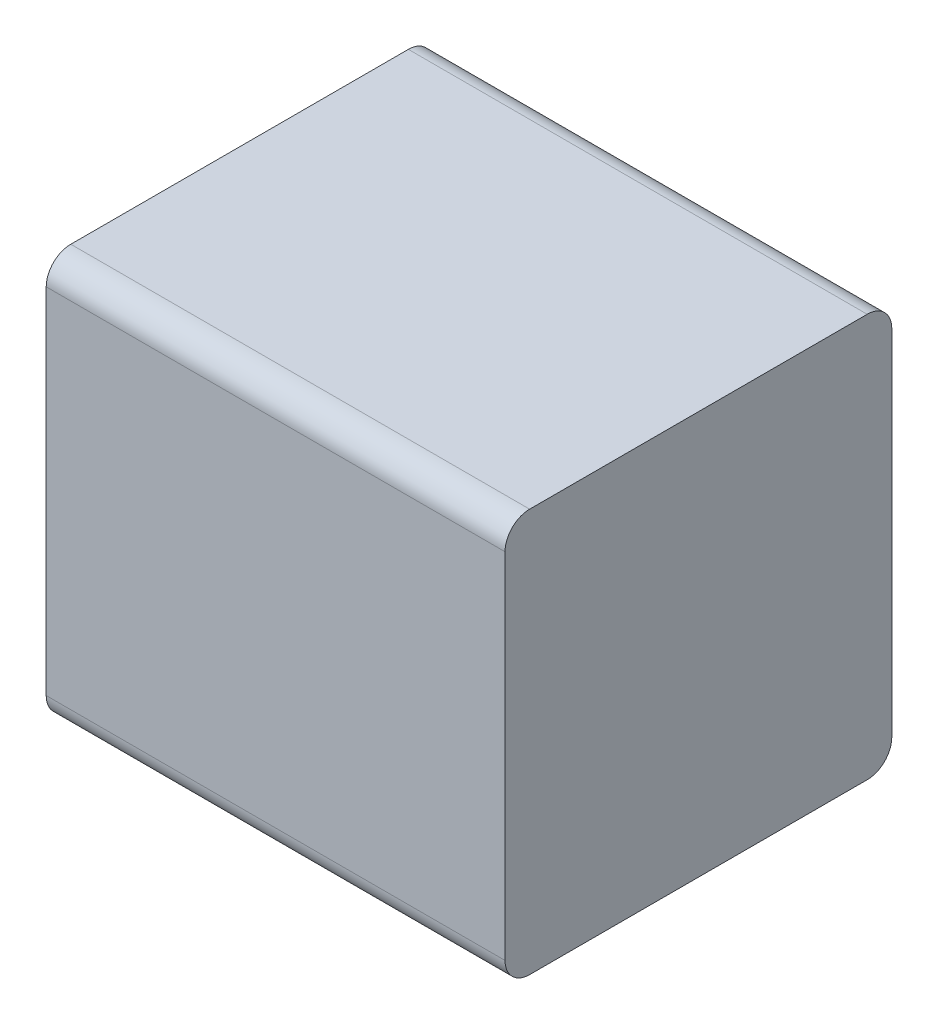
ISO-10303-21;
HEADER;
FILE_DESCRIPTION(('STEP AP214'),'2;1');
FILE_NAME('part.step','',(''),(''),'','','');
FILE_SCHEMA(('AUTOMOTIVE_DESIGN { 1 0 10303 214 1 1 1 1 }'));
ENDSEC;
DATA;
#1=APPLICATION_CONTEXT('core data for automotive mechanical design processes');
#2=APPLICATION_PROTOCOL_DEFINITION('international standard','automotive_design',2000,#1);
#3=PRODUCT_CONTEXT('',#1,'mechanical');
#4=PRODUCT('Part','Part','',(#3));
#5=PRODUCT_RELATED_PRODUCT_CATEGORY('part','',(#4));
#6=PRODUCT_DEFINITION_FORMATION('','',#4);
#7=PRODUCT_DEFINITION_CONTEXT('part definition',#1,'design');
#8=PRODUCT_DEFINITION('design','',#6,#7);
#9=PRODUCT_DEFINITION_SHAPE('','',#8);
#10=(LENGTH_UNIT() NAMED_UNIT(*) SI_UNIT(.MILLI.,.METRE.));
#11=(NAMED_UNIT(*) PLANE_ANGLE_UNIT() SI_UNIT($,.RADIAN.));
#12=(NAMED_UNIT(*) SI_UNIT($,.STERADIAN.) SOLID_ANGLE_UNIT());
#13=UNCERTAINTY_MEASURE_WITH_UNIT(LENGTH_MEASURE(1.E-05),#10,'distance_accuracy_value','');
#14=(GEOMETRIC_REPRESENTATION_CONTEXT(3) GLOBAL_UNCERTAINTY_ASSIGNED_CONTEXT((#13)) GLOBAL_UNIT_ASSIGNED_CONTEXT((#10,
#11,#12)) REPRESENTATION_CONTEXT('',''));
#15=CARTESIAN_POINT('',(0.,0.,0.));
#16=DIRECTION('',(0.,0.,1.));
#17=DIRECTION('',(1.,0.,0.));
#18=AXIS2_PLACEMENT_3D('',#15,#16,#17);
#19=CARTESIAN_POINT('',(0.,-0.54,1.115));
#20=DIRECTION('',(-1.,0.,0.));
#21=DIRECTION('',(0.,0.,1.));
#22=AXIS2_PLACEMENT_3D('',#19,#20,#21);
#23=CYLINDRICAL_SURFACE('',#22,0.075);
#24=CARTESIAN_POINT('',(-0.7,-0.54,1.115));
#25=DIRECTION('',(-1.,0.,0.));
#26=DIRECTION('',(0.,0.,1.));
#27=AXIS2_PLACEMENT_3D('',#24,#25,#26);
#28=CIRCLE('',#27,0.075);
#29=CARTESIAN_POINT('',(-0.7,-0.54,1.19));
#30=VERTEX_POINT('',#29);
#31=CARTESIAN_POINT('',(-0.7,-0.615,1.115));
#32=VERTEX_POINT('',#31);
#33=EDGE_CURVE('E87',#30,#32,#28,.F.);
#34=ORIENTED_EDGE('',*,*,#33,.T.);
#35=DIRECTION('',(1.,0.,0.));
#36=VECTOR('',#35,1.);
#37=CARTESIAN_POINT('',(0.,-0.615,1.115));
#38=LINE('',#37,#36);
#39=CARTESIAN_POINT('',(0.699999999999999,-0.615,1.115));
#40=VERTEX_POINT('',#39);
#41=EDGE_CURVE('E85',#32,#40,#38,.T.);
#42=ORIENTED_EDGE('',*,*,#41,.T.);
#43=CARTESIAN_POINT('',(0.7,-0.54,1.115));
#44=DIRECTION('',(-1.,0.,0.));
#45=DIRECTION('',(0.,0.,1.));
#46=AXIS2_PLACEMENT_3D('',#43,#44,#45);
#47=CIRCLE('',#46,0.075);
#48=CARTESIAN_POINT('',(0.699999999999999,-0.54,1.19));
#49=VERTEX_POINT('',#48);
#50=EDGE_CURVE('E19',#40,#49,#47,.T.);
#51=ORIENTED_EDGE('',*,*,#50,.T.);
#52=DIRECTION('',(1.,0.,0.));
#53=VECTOR('',#52,1.);
#54=CARTESIAN_POINT('',(0.,-0.54,1.19));
#55=LINE('',#54,#53);
#56=EDGE_CURVE('E82',#30,#49,#55,.T.);
#57=ORIENTED_EDGE('',*,*,#56,.F.);
#58=EDGE_LOOP('',(#34,#42,#51,#57));
#59=FACE_BOUND('',#58,.T.);
#60=ADVANCED_FACE('F16',(#59),#23,.T.);
#61=CARTESIAN_POINT('',(0.,0.54,1.115));
#62=DIRECTION('',(-1.,0.,0.));
#63=DIRECTION('',(0.,0.,1.));
#64=AXIS2_PLACEMENT_3D('',#61,#62,#63);
#65=CYLINDRICAL_SURFACE('',#64,0.075);
#66=CARTESIAN_POINT('',(-0.7,0.54,1.115));
#67=DIRECTION('',(-1.,0.,0.));
#68=DIRECTION('',(0.,0.,1.));
#69=AXIS2_PLACEMENT_3D('',#66,#67,#68);
#70=CIRCLE('',#69,0.075);
#71=CARTESIAN_POINT('',(-0.7,0.615,1.115));
#72=VERTEX_POINT('',#71);
#73=CARTESIAN_POINT('',(-0.7,0.54,1.19));
#74=VERTEX_POINT('',#73);
#75=EDGE_CURVE('E121',#72,#74,#70,.F.);
#76=ORIENTED_EDGE('',*,*,#75,.T.);
#77=DIRECTION('',(1.,0.,0.));
#78=VECTOR('',#77,1.);
#79=CARTESIAN_POINT('',(0.,0.54,1.19));
#80=LINE('',#79,#78);
#81=CARTESIAN_POINT('',(0.699999999999999,0.54,1.19));
#82=VERTEX_POINT('',#81);
#83=EDGE_CURVE('E95',#82,#74,#80,.F.);
#84=ORIENTED_EDGE('',*,*,#83,.F.);
#85=CARTESIAN_POINT('',(0.7,0.54,1.115));
#86=DIRECTION('',(-1.,0.,0.));
#87=DIRECTION('',(0.,0.,1.));
#88=AXIS2_PLACEMENT_3D('',#85,#86,#87);
#89=CIRCLE('',#88,0.075);
#90=CARTESIAN_POINT('',(0.699999999999999,0.615,1.115));
#91=VERTEX_POINT('',#90);
#92=EDGE_CURVE('E99',#82,#91,#89,.T.);
#93=ORIENTED_EDGE('',*,*,#92,.T.);
#94=DIRECTION('',(1.,0.,0.));
#95=VECTOR('',#94,1.);
#96=CARTESIAN_POINT('',(0.,0.615,1.115));
#97=LINE('',#96,#95);
#98=EDGE_CURVE('E116',#72,#91,#97,.T.);
#99=ORIENTED_EDGE('',*,*,#98,.F.);
#100=EDGE_LOOP('',(#76,#84,#93,#99));
#101=FACE_BOUND('',#100,.T.);
#102=ADVANCED_FACE('F226',(#101),#65,.T.);
#103=CARTESIAN_POINT('',(0.,-0.615,0.6));
#104=DIRECTION('',(0.,1.,0.));
#105=DIRECTION('',(0.,0.,1.));
#106=AXIS2_PLACEMENT_3D('',#103,#104,#105);
#107=PLANE('',#106);
#108=ORIENTED_EDGE('',*,*,#41,.F.);
#109=DIRECTION('',(0.,0.,1.));
#110=VECTOR('',#109,1.);
#111=CARTESIAN_POINT('',(-0.7,-0.615,0.6));
#112=LINE('',#111,#110);
#113=CARTESIAN_POINT('',(-0.7,-0.615,0.0849999999999899));
#114=VERTEX_POINT('',#113);
#115=EDGE_CURVE('E126',#114,#32,#112,.T.);
#116=ORIENTED_EDGE('',*,*,#115,.F.);
#117=DIRECTION('',(1.,0.,0.));
#118=VECTOR('',#117,1.);
#119=CARTESIAN_POINT('',(0.,-0.615,0.0849999999999899));
#120=LINE('',#119,#118);
#121=CARTESIAN_POINT('',(0.700000000000001,-0.615,0.0849999999999901));
#122=VERTEX_POINT('',#121);
#123=EDGE_CURVE('E105',#122,#114,#120,.F.);
#124=ORIENTED_EDGE('',*,*,#123,.F.);
#125=DIRECTION('',(0.,0.,-1.));
#126=VECTOR('',#125,1.);
#127=CARTESIAN_POINT('',(0.7,-0.615,0.6));
#128=LINE('',#127,#126);
#129=EDGE_CURVE('E113',#40,#122,#128,.T.);
#130=ORIENTED_EDGE('',*,*,#129,.F.);
#131=EDGE_LOOP('',(#108,#116,#124,#130));
#132=FACE_BOUND('',#131,.T.);
#133=ADVANCED_FACE('F136',(#132),#107,.F.);
#134=CARTESIAN_POINT('',(0.,-0.615,1.19));
#135=DIRECTION('',(0.,0.,1.));
#136=DIRECTION('',(1.,0.,0.));
#137=AXIS2_PLACEMENT_3D('',#134,#135,#136);
#138=PLANE('',#137);
#139=ORIENTED_EDGE('',*,*,#83,.T.);
#140=DIRECTION('',(0.,1.,0.));
#141=VECTOR('',#140,1.);
#142=CARTESIAN_POINT('',(-0.7,-0.615,1.19));
#143=LINE('',#142,#141);
#144=EDGE_CURVE('E94',#30,#74,#143,.T.);
#145=ORIENTED_EDGE('',*,*,#144,.F.);
#146=ORIENTED_EDGE('',*,*,#56,.T.);
#147=DIRECTION('',(0.,1.,0.));
#148=VECTOR('',#147,1.);
#149=CARTESIAN_POINT('',(0.699999999999999,-0.615,1.19));
#150=LINE('',#149,#148);
#151=EDGE_CURVE('E92',#82,#49,#150,.F.);
#152=ORIENTED_EDGE('',*,*,#151,.F.);
#153=EDGE_LOOP('',(#139,#145,#146,#152));
#154=FACE_BOUND('',#153,.T.);
#155=ADVANCED_FACE('F91',(#154),#138,.T.);
#156=CARTESIAN_POINT('',(0.,0.615,0.6));
#157=DIRECTION('',(0.,1.,0.));
#158=DIRECTION('',(0.,0.,1.));
#159=AXIS2_PLACEMENT_3D('',#156,#157,#158);
#160=PLANE('',#159);
#161=DIRECTION('',(1.,0.,0.));
#162=VECTOR('',#161,1.);
#163=CARTESIAN_POINT('',(0.,0.615,0.0849999999999901));
#164=LINE('',#163,#162);
#165=CARTESIAN_POINT('',(-0.7,0.615,0.08499999999999));
#166=VERTEX_POINT('',#165);
#167=CARTESIAN_POINT('',(0.700000000000001,0.615,0.0849999999999901));
#168=VERTEX_POINT('',#167);
#169=EDGE_CURVE('E115',#166,#168,#164,.T.);
#170=ORIENTED_EDGE('',*,*,#169,.F.);
#171=DIRECTION('',(0.,0.,1.));
#172=VECTOR('',#171,1.);
#173=CARTESIAN_POINT('',(-0.7,0.615,0.6));
#174=LINE('',#173,#172);
#175=EDGE_CURVE('E140',#72,#166,#174,.F.);
#176=ORIENTED_EDGE('',*,*,#175,.F.);
#177=ORIENTED_EDGE('',*,*,#98,.T.);
#178=DIRECTION('',(0.,0.,-1.));
#179=VECTOR('',#178,1.);
#180=CARTESIAN_POINT('',(0.7,0.615,0.6));
#181=LINE('',#180,#179);
#182=EDGE_CURVE('E102',#168,#91,#181,.F.);
#183=ORIENTED_EDGE('',*,*,#182,.F.);
#184=EDGE_LOOP('',(#170,#176,#177,#183));
#185=FACE_BOUND('',#184,.T.);
#186=ADVANCED_FACE('F154',(#185),#160,.T.);
#187=CARTESIAN_POINT('',(0.,0.54,0.08499999999999));
#188=DIRECTION('',(1.,0.,0.));
#189=DIRECTION('',(0.,0.,-1.));
#190=AXIS2_PLACEMENT_3D('',#187,#188,#189);
#191=CYLINDRICAL_SURFACE('',#190,0.075);
#192=CARTESIAN_POINT('',(0.7,0.54,0.0849999999999901));
#193=DIRECTION('',(1.,0.,0.));
#194=DIRECTION('',(0.,0.,-1.));
#195=AXIS2_PLACEMENT_3D('',#192,#193,#194);
#196=CIRCLE('',#195,0.075);
#197=CARTESIAN_POINT('',(0.7,0.54,0.00999999999999308));
#198=VERTEX_POINT('',#197);
#199=EDGE_CURVE('E107',#198,#168,#196,.T.);
#200=ORIENTED_EDGE('',*,*,#199,.F.);
#201=DIRECTION('',(-1.,0.,0.));
#202=VECTOR('',#201,1.);
#203=CARTESIAN_POINT('',(0.,0.54,0.009999999999993));
#204=LINE('',#203,#202);
#205=CARTESIAN_POINT('',(-0.7,0.54,0.00999999999999292));
#206=VERTEX_POINT('',#205);
#207=EDGE_CURVE('E145',#206,#198,#204,.F.);
#208=ORIENTED_EDGE('',*,*,#207,.F.);
#209=CARTESIAN_POINT('',(-0.7,0.54,0.0849999999999899));
#210=DIRECTION('',(1.,0.,0.));
#211=DIRECTION('',(0.,0.,-1.));
#212=AXIS2_PLACEMENT_3D('',#209,#210,#211);
#213=CIRCLE('',#212,0.075);
#214=EDGE_CURVE('E123',#166,#206,#213,.F.);
#215=ORIENTED_EDGE('',*,*,#214,.F.);
#216=ORIENTED_EDGE('',*,*,#169,.T.);
#217=EDGE_LOOP('',(#200,#208,#215,#216));
#218=FACE_BOUND('',#217,.T.);
#219=ADVANCED_FACE('F157',(#218),#191,.T.);
#220=CARTESIAN_POINT('',(0.7,-0.615,0.6));
#221=DIRECTION('',(1.,0.,0.));
#222=DIRECTION('',(0.,0.,-1.));
#223=AXIS2_PLACEMENT_3D('',#220,#221,#222);
#224=PLANE('',#223);
#225=ORIENTED_EDGE('',*,*,#92,.F.);
#226=ORIENTED_EDGE('',*,*,#151,.T.);
#227=ORIENTED_EDGE('',*,*,#50,.F.);
#228=ORIENTED_EDGE('',*,*,#129,.T.);
#229=CARTESIAN_POINT('',(0.7,-0.54,0.0849999999999901));
#230=DIRECTION('',(1.,0.,0.));
#231=DIRECTION('',(0.,0.,-1.));
#232=AXIS2_PLACEMENT_3D('',#229,#230,#231);
#233=CIRCLE('',#232,0.075);
#234=CARTESIAN_POINT('',(0.7,-0.54,0.00999999999999308));
#235=VERTEX_POINT('',#234);
#236=EDGE_CURVE('E101',#235,#122,#233,.F.);
#237=ORIENTED_EDGE('',*,*,#236,.F.);
#238=DIRECTION('',(0.,1.,0.));
#239=VECTOR('',#238,1.);
#240=CARTESIAN_POINT('',(0.7,-0.615,0.00999999999999308));
#241=LINE('',#240,#239);
#242=EDGE_CURVE('E110',#198,#235,#241,.F.);
#243=ORIENTED_EDGE('',*,*,#242,.F.);
#244=ORIENTED_EDGE('',*,*,#199,.T.);
#245=ORIENTED_EDGE('',*,*,#182,.T.);
#246=EDGE_LOOP('',(#225,#226,#227,#228,#237,#243,#244,#245));
#247=FACE_BOUND('',#246,.T.);
#248=ADVANCED_FACE('F97',(#247),#224,.T.);
#249=CARTESIAN_POINT('',(0.,-0.54,0.08499999999999));
#250=DIRECTION('',(1.,0.,0.));
#251=DIRECTION('',(0.,0.,-1.));
#252=AXIS2_PLACEMENT_3D('',#249,#250,#251);
#253=CYLINDRICAL_SURFACE('',#252,0.075);
#254=ORIENTED_EDGE('',*,*,#236,.T.);
#255=ORIENTED_EDGE('',*,*,#123,.T.);
#256=CARTESIAN_POINT('',(-0.7,-0.54,0.0849999999999899));
#257=DIRECTION('',(1.,0.,0.));
#258=DIRECTION('',(0.,0.,-1.));
#259=AXIS2_PLACEMENT_3D('',#256,#257,#258);
#260=CIRCLE('',#259,0.075);
#261=CARTESIAN_POINT('',(-0.7,-0.54,0.00999999999999292));
#262=VERTEX_POINT('',#261);
#263=EDGE_CURVE('E34',#262,#114,#260,.F.);
#264=ORIENTED_EDGE('',*,*,#263,.F.);
#265=DIRECTION('',(-1.,0.,0.));
#266=VECTOR('',#265,1.);
#267=CARTESIAN_POINT('',(0.,-0.54,0.009999999999993));
#268=LINE('',#267,#266);
#269=EDGE_CURVE('E25',#235,#262,#268,.T.);
#270=ORIENTED_EDGE('',*,*,#269,.F.);
#271=EDGE_LOOP('',(#254,#255,#264,#270));
#272=FACE_BOUND('',#271,.T.);
#273=ADVANCED_FACE('F160',(#272),#253,.T.);
#274=CARTESIAN_POINT('',(-0.7,-0.615,0.6));
#275=DIRECTION('',(-1.,0.,0.));
#276=DIRECTION('',(0.,0.,1.));
#277=AXIS2_PLACEMENT_3D('',#274,#275,#276);
#278=PLANE('',#277);
#279=ORIENTED_EDGE('',*,*,#75,.F.);
#280=ORIENTED_EDGE('',*,*,#175,.T.);
#281=ORIENTED_EDGE('',*,*,#214,.T.);
#282=DIRECTION('',(0.,1.,0.));
#283=VECTOR('',#282,1.);
#284=CARTESIAN_POINT('',(-0.7,-0.615,0.00999999999999292));
#285=LINE('',#284,#283);
#286=EDGE_CURVE('E11',#262,#206,#285,.T.);
#287=ORIENTED_EDGE('',*,*,#286,.F.);
#288=ORIENTED_EDGE('',*,*,#263,.T.);
#289=ORIENTED_EDGE('',*,*,#115,.T.);
#290=ORIENTED_EDGE('',*,*,#33,.F.);
#291=ORIENTED_EDGE('',*,*,#144,.T.);
#292=EDGE_LOOP('',(#279,#280,#281,#287,#288,#289,#290,#291));
#293=FACE_BOUND('',#292,.T.);
#294=ADVANCED_FACE('F138',(#293),#278,.T.);
#295=CARTESIAN_POINT('',(0.,-0.615,0.009999999999993));
#296=DIRECTION('',(0.,0.,-1.));
#297=DIRECTION('',(-1.,0.,0.));
#298=AXIS2_PLACEMENT_3D('',#295,#296,#297);
#299=PLANE('',#298);
#300=ORIENTED_EDGE('',*,*,#269,.T.);
#301=ORIENTED_EDGE('',*,*,#286,.T.);
#302=ORIENTED_EDGE('',*,*,#207,.T.);
#303=ORIENTED_EDGE('',*,*,#242,.T.);
#304=EDGE_LOOP('',(#300,#301,#302,#303));
#305=FACE_BOUND('',#304,.T.);
#306=ADVANCED_FACE('F159',(#305),#299,.T.);
#307=CLOSED_SHELL('',(#60,#102,#133,#155,#186,#219,#248,#273,#294,#306));
#308=MANIFOLD_SOLID_BREP('B1',#307);
#309=ADVANCED_BREP_SHAPE_REPRESENTATION('',(#18,#308),#14);
#310=SHAPE_DEFINITION_REPRESENTATION(#9,#309);
ENDSEC;
END-ISO-10303-21;
